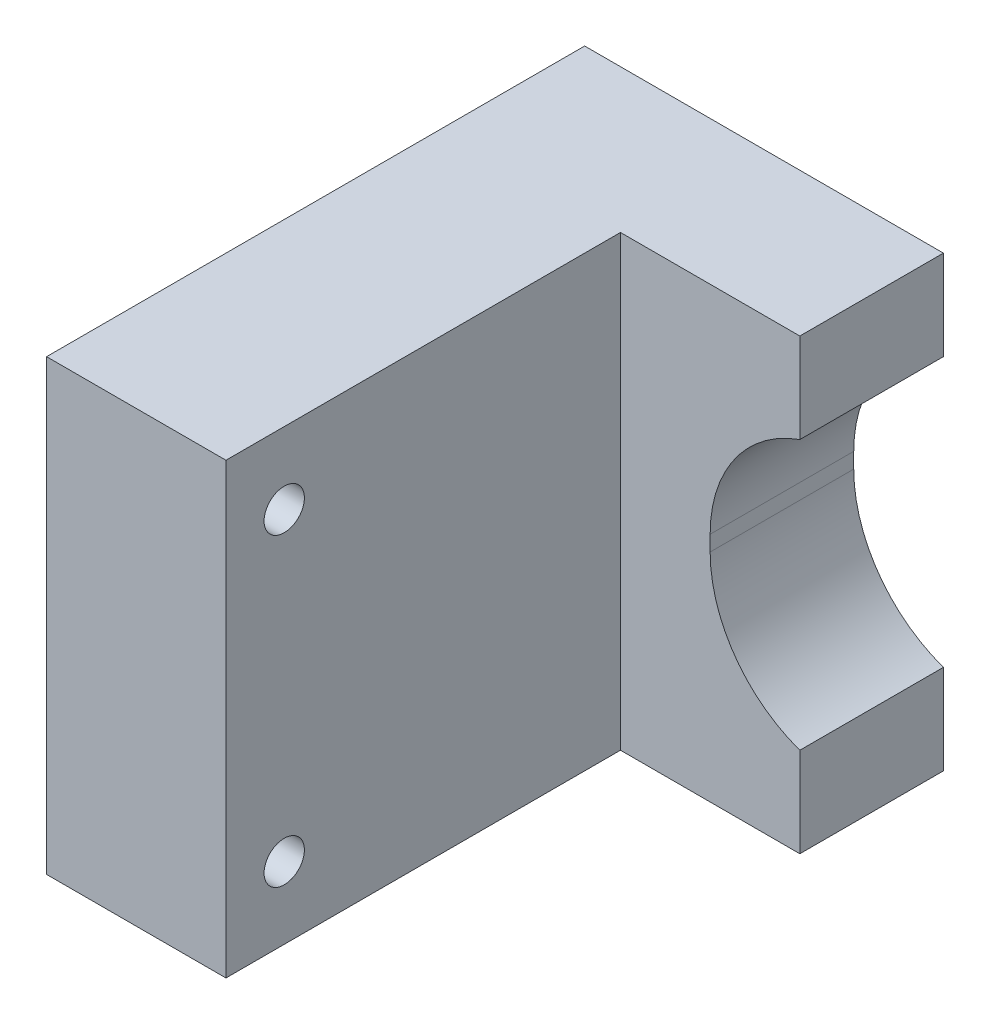
ISO-10303-21;
HEADER;
FILE_DESCRIPTION(('STEP AP214'),'2;1');
FILE_NAME('part.step','',(''),(''),'','','');
FILE_SCHEMA(('AUTOMOTIVE_DESIGN { 1 0 10303 214 1 1 1 1 }'));
ENDSEC;
DATA;
#1=APPLICATION_CONTEXT('core data for automotive mechanical design processes');
#2=APPLICATION_PROTOCOL_DEFINITION('international standard','automotive_design',2000,#1);
#3=PRODUCT_CONTEXT('',#1,'mechanical');
#4=PRODUCT('Part','Part','',(#3));
#5=PRODUCT_RELATED_PRODUCT_CATEGORY('part','',(#4));
#6=PRODUCT_DEFINITION_FORMATION('','',#4);
#7=PRODUCT_DEFINITION_CONTEXT('part definition',#1,'design');
#8=PRODUCT_DEFINITION('design','',#6,#7);
#9=PRODUCT_DEFINITION_SHAPE('','',#8);
#10=(LENGTH_UNIT() NAMED_UNIT(*) SI_UNIT(.MILLI.,.METRE.));
#11=(NAMED_UNIT(*) PLANE_ANGLE_UNIT() SI_UNIT($,.RADIAN.));
#12=(NAMED_UNIT(*) SI_UNIT($,.STERADIAN.) SOLID_ANGLE_UNIT());
#13=UNCERTAINTY_MEASURE_WITH_UNIT(LENGTH_MEASURE(1.E-05),#10,'distance_accuracy_value','');
#14=(GEOMETRIC_REPRESENTATION_CONTEXT(3) GLOBAL_UNCERTAINTY_ASSIGNED_CONTEXT((#13)) GLOBAL_UNIT_ASSIGNED_CONTEXT((#10,
#11,#12)) REPRESENTATION_CONTEXT('',''));
#15=CARTESIAN_POINT('',(0.,0.,0.));
#16=DIRECTION('',(0.,0.,1.));
#17=DIRECTION('',(1.,0.,0.));
#18=AXIS2_PLACEMENT_3D('',#15,#16,#17);
#19=CARTESIAN_POINT('',(30.,50.,0.));
#20=DIRECTION('',(1.,0.,0.));
#21=DIRECTION('',(0.,0.,-1.));
#22=AXIS2_PLACEMENT_3D('',#19,#20,#21);
#23=PLANE('',#22);
#24=DIRECTION('',(0.,0.,1.));
#25=VECTOR('',#24,1.);
#26=CARTESIAN_POINT('',(30.,40.,-13.9903927951499));
#27=LINE('',#26,#25);
#28=CARTESIAN_POINT('',(30.,40.,-30.));
#29=VERTEX_POINT('',#28);
#30=CARTESIAN_POINT('',(30.,40.,-13.9903927951499));
#31=VERTEX_POINT('',#30);
#32=EDGE_CURVE('E120',#29,#31,#27,.T.);
#33=ORIENTED_EDGE('',*,*,#32,.F.);
#34=DIRECTION('',(0.,-1.,0.));
#35=VECTOR('',#34,1.);
#36=CARTESIAN_POINT('',(30.,50.,-30.));
#37=LINE('',#36,#35);
#38=CARTESIAN_POINT('',(30.,50.,-30.));
#39=VERTEX_POINT('',#38);
#40=EDGE_CURVE('E133',#39,#29,#37,.T.);
#41=ORIENTED_EDGE('',*,*,#40,.F.);
#42=DIRECTION('',(0.,0.,1.));
#43=VECTOR('',#42,1.);
#44=CARTESIAN_POINT('',(30.,50.,0.));
#45=LINE('',#44,#43);
#46=CARTESIAN_POINT('',(30.,50.,-13.9903927951499));
#47=VERTEX_POINT('',#46);
#48=EDGE_CURVE('E172',#39,#47,#45,.T.);
#49=ORIENTED_EDGE('',*,*,#48,.T.);
#50=DIRECTION('',(0.,-1.,0.));
#51=VECTOR('',#50,1.);
#52=CARTESIAN_POINT('',(30.,50.,-13.9903927951499));
#53=LINE('',#52,#51);
#54=EDGE_CURVE('E132',#47,#31,#53,.T.);
#55=ORIENTED_EDGE('',*,*,#54,.T.);
#56=EDGE_LOOP('',(#33,#41,#49,#55));
#57=FACE_BOUND('',#56,.T.);
#58=ADVANCED_FACE('F35',(#57),#23,.T.);
#59=CARTESIAN_POINT('',(-10.,50.,0.));
#60=DIRECTION('',(-1.,0.,0.));
#61=DIRECTION('',(0.,0.,1.));
#62=AXIS2_PLACEMENT_3D('',#59,#60,#61);
#63=PLANE('',#62);
#64=CARTESIAN_POINT('',(-10.,8.,23.5));
#65=DIRECTION('',(-1.,0.,0.));
#66=DIRECTION('',(0.,0.,1.));
#67=AXIS2_PLACEMENT_3D('',#64,#65,#66);
#68=CIRCLE('',#67,4.2164);
#69=CARTESIAN_POINT('',(-10.,8.,27.7164));
#70=VERTEX_POINT('',#69);
#71=EDGE_CURVE('E203',#70,#70,#68,.T.);
#72=ORIENTED_EDGE('',*,*,#71,.F.);
#73=EDGE_LOOP('',(#72));
#74=FACE_BOUND('',#73,.T.);
#75=CARTESIAN_POINT('',(-10.,42.,23.5));
#76=DIRECTION('',(-1.,0.,0.));
#77=DIRECTION('',(0.,0.,1.));
#78=AXIS2_PLACEMENT_3D('',#75,#76,#77);
#79=CIRCLE('',#78,4.2164);
#80=CARTESIAN_POINT('',(-10.,42.,27.7164));
#81=VERTEX_POINT('',#80);
#82=EDGE_CURVE('E194',#81,#81,#79,.T.);
#83=ORIENTED_EDGE('',*,*,#82,.F.);
#84=EDGE_LOOP('',(#83));
#85=FACE_BOUND('',#84,.T.);
#86=DIRECTION('',(0.,0.,-1.));
#87=VECTOR('',#86,1.);
#88=CARTESIAN_POINT('',(-10.,0.,0.));
#89=LINE('',#88,#87);
#90=CARTESIAN_POINT('',(-10.,0.,30.));
#91=VERTEX_POINT('',#90);
#92=CARTESIAN_POINT('',(-10.,0.,-30.));
#93=VERTEX_POINT('',#92);
#94=EDGE_CURVE('E167',#91,#93,#89,.T.);
#95=ORIENTED_EDGE('',*,*,#94,.F.);
#96=DIRECTION('',(0.,-1.,0.));
#97=VECTOR('',#96,1.);
#98=CARTESIAN_POINT('',(-10.,50.,30.));
#99=LINE('',#98,#97);
#100=CARTESIAN_POINT('',(-10.,50.,30.));
#101=VERTEX_POINT('',#100);
#102=EDGE_CURVE('E144',#101,#91,#99,.T.);
#103=ORIENTED_EDGE('',*,*,#102,.F.);
#104=DIRECTION('',(0.,0.,-1.));
#105=VECTOR('',#104,1.);
#106=CARTESIAN_POINT('',(-10.,50.,0.));
#107=LINE('',#106,#105);
#108=CARTESIAN_POINT('',(-10.,50.,-30.));
#109=VERTEX_POINT('',#108);
#110=EDGE_CURVE('E158',#101,#109,#107,.T.);
#111=ORIENTED_EDGE('',*,*,#110,.T.);
#112=DIRECTION('',(0.,-1.,0.));
#113=VECTOR('',#112,1.);
#114=CARTESIAN_POINT('',(-10.,50.,-30.));
#115=LINE('',#114,#113);
#116=EDGE_CURVE('E152',#109,#93,#115,.T.);
#117=ORIENTED_EDGE('',*,*,#116,.T.);
#118=EDGE_LOOP('',(#95,#103,#111,#117));
#119=FACE_BOUND('',#118,.T.);
#120=ADVANCED_FACE('F257',(#74,#85,#119),#63,.T.);
#121=CARTESIAN_POINT('',(0.,50.,30.));
#122=DIRECTION('',(0.,0.,1.));
#123=DIRECTION('',(1.,0.,0.));
#124=AXIS2_PLACEMENT_3D('',#121,#122,#123);
#125=PLANE('',#124);
#126=DIRECTION('',(-1.,0.,0.));
#127=VECTOR('',#126,1.);
#128=CARTESIAN_POINT('',(0.,0.,30.));
#129=LINE('',#128,#127);
#130=CARTESIAN_POINT('',(10.,0.,30.));
#131=VERTEX_POINT('',#130);
#132=EDGE_CURVE('E164',#131,#91,#129,.T.);
#133=ORIENTED_EDGE('',*,*,#132,.F.);
#134=DIRECTION('',(0.,-1.,0.));
#135=VECTOR('',#134,1.);
#136=CARTESIAN_POINT('',(10.,50.,30.));
#137=LINE('',#136,#135);
#138=CARTESIAN_POINT('',(10.,50.,30.));
#139=VERTEX_POINT('',#138);
#140=EDGE_CURVE('E146',#139,#131,#137,.T.);
#141=ORIENTED_EDGE('',*,*,#140,.F.);
#142=DIRECTION('',(-1.,0.,0.));
#143=VECTOR('',#142,1.);
#144=CARTESIAN_POINT('',(0.,50.,30.));
#145=LINE('',#144,#143);
#146=EDGE_CURVE('E179',#139,#101,#145,.T.);
#147=ORIENTED_EDGE('',*,*,#146,.T.);
#148=ORIENTED_EDGE('',*,*,#102,.T.);
#149=EDGE_LOOP('',(#133,#141,#147,#148));
#150=FACE_BOUND('',#149,.T.);
#151=ADVANCED_FACE('F259',(#150),#125,.T.);
#152=CARTESIAN_POINT('',(10.,50.,0.));
#153=DIRECTION('',(-1.,0.,0.));
#154=DIRECTION('',(0.,0.,1.));
#155=AXIS2_PLACEMENT_3D('',#152,#153,#154);
#156=PLANE('',#155);
#157=CARTESIAN_POINT('',(10.,8.,23.5));
#158=DIRECTION('',(-1.,0.,0.));
#159=DIRECTION('',(0.,0.,1.));
#160=AXIS2_PLACEMENT_3D('',#157,#158,#159);
#161=CIRCLE('',#160,2.2479);
#162=CARTESIAN_POINT('',(10.,8.,25.7479));
#163=VERTEX_POINT('',#162);
#164=EDGE_CURVE('E197',#163,#163,#161,.T.);
#165=ORIENTED_EDGE('',*,*,#164,.T.);
#166=EDGE_LOOP('',(#165));
#167=FACE_BOUND('',#166,.T.);
#168=CARTESIAN_POINT('',(10.,42.,23.5));
#169=DIRECTION('',(-1.,0.,0.));
#170=DIRECTION('',(0.,0.,1.));
#171=AXIS2_PLACEMENT_3D('',#168,#169,#170);
#172=CIRCLE('',#171,2.2479);
#173=CARTESIAN_POINT('',(10.,42.,25.7479));
#174=VERTEX_POINT('',#173);
#175=EDGE_CURVE('E121',#174,#174,#172,.T.);
#176=ORIENTED_EDGE('',*,*,#175,.T.);
#177=EDGE_LOOP('',(#176));
#178=FACE_BOUND('',#177,.T.);
#179=DIRECTION('',(0.,0.,-1.));
#180=VECTOR('',#179,1.);
#181=CARTESIAN_POINT('',(10.,0.,0.));
#182=LINE('',#181,#180);
#183=CARTESIAN_POINT('',(10.,0.,-13.9903927951499));
#184=VERTEX_POINT('',#183);
#185=EDGE_CURVE('E162',#131,#184,#182,.T.);
#186=ORIENTED_EDGE('',*,*,#185,.T.);
#187=DIRECTION('',(0.,-1.,0.));
#188=VECTOR('',#187,1.);
#189=CARTESIAN_POINT('',(10.,50.,-13.9903927951499));
#190=LINE('',#189,#188);
#191=CARTESIAN_POINT('',(10.,50.,-13.9903927951499));
#192=VERTEX_POINT('',#191);
#193=EDGE_CURVE('E148',#192,#184,#190,.T.);
#194=ORIENTED_EDGE('',*,*,#193,.F.);
#195=DIRECTION('',(0.,0.,-1.));
#196=VECTOR('',#195,1.);
#197=CARTESIAN_POINT('',(10.,50.,0.));
#198=LINE('',#197,#196);
#199=EDGE_CURVE('E177',#139,#192,#198,.T.);
#200=ORIENTED_EDGE('',*,*,#199,.F.);
#201=ORIENTED_EDGE('',*,*,#140,.T.);
#202=EDGE_LOOP('',(#186,#194,#200,#201));
#203=FACE_BOUND('',#202,.T.);
#204=ADVANCED_FACE('F260',(#167,#178,#203),#156,.F.);
#205=CARTESIAN_POINT('',(0.,50.,-13.9903927951499));
#206=DIRECTION('',(0.,0.,-1.));
#207=DIRECTION('',(-1.,0.,0.));
#208=AXIS2_PLACEMENT_3D('',#205,#206,#207);
#209=PLANE('',#208);
#210=DIRECTION('',(0.,-1.,0.));
#211=VECTOR('',#210,1.);
#212=CARTESIAN_POINT('',(20.,40.,-13.9903927951499));
#213=LINE('',#212,#211);
#214=CARTESIAN_POINT('',(20.,25.8578643762691,-13.9903927951499));
#215=VERTEX_POINT('',#214);
#216=CARTESIAN_POINT('',(20.,24.142135623731,-13.9903927951499));
#217=VERTEX_POINT('',#216);
#218=EDGE_CURVE('E185',#215,#217,#213,.T.);
#219=ORIENTED_EDGE('',*,*,#218,.F.);
#220=CARTESIAN_POINT('',(35.,25.8578643762691,-13.9903927951499));
#221=DIRECTION('',(0.,0.,-1.));
#222=DIRECTION('',(-1.,0.,0.));
#223=AXIS2_PLACEMENT_3D('',#220,#221,#222);
#224=CIRCLE('',#223,15.);
#225=EDGE_CURVE('E43',#215,#31,#224,.T.);
#226=ORIENTED_EDGE('',*,*,#225,.T.);
#227=ORIENTED_EDGE('',*,*,#54,.F.);
#228=DIRECTION('',(1.,0.,0.));
#229=VECTOR('',#228,1.);
#230=CARTESIAN_POINT('',(0.,50.,-13.9903927951499));
#231=LINE('',#230,#229);
#232=EDGE_CURVE('E175',#192,#47,#231,.T.);
#233=ORIENTED_EDGE('',*,*,#232,.F.);
#234=ORIENTED_EDGE('',*,*,#193,.T.);
#235=DIRECTION('',(1.,0.,0.));
#236=VECTOR('',#235,1.);
#237=CARTESIAN_POINT('',(0.,0.,-13.9903927951499));
#238=LINE('',#237,#236);
#239=CARTESIAN_POINT('',(30.,0.,-13.9903927951499));
#240=VERTEX_POINT('',#239);
#241=EDGE_CURVE('E130',#184,#240,#238,.T.);
#242=ORIENTED_EDGE('',*,*,#241,.T.);
#243=CARTESIAN_POINT('',(30.,10.,-13.9903927951499));
#244=VERTEX_POINT('',#243);
#245=EDGE_CURVE('E116',#244,#240,#53,.T.);
#246=ORIENTED_EDGE('',*,*,#245,.F.);
#247=CARTESIAN_POINT('',(35.,24.142135623731,-13.9903927951499));
#248=DIRECTION('',(0.,0.,-1.));
#249=DIRECTION('',(-1.,0.,0.));
#250=AXIS2_PLACEMENT_3D('',#247,#248,#249);
#251=CIRCLE('',#250,15.);
#252=EDGE_CURVE('E126',#244,#217,#251,.T.);
#253=ORIENTED_EDGE('',*,*,#252,.T.);
#254=EDGE_LOOP('',(#219,#226,#227,#233,#234,#242,#246,#253));
#255=FACE_BOUND('',#254,.T.);
#256=ADVANCED_FACE('F125',(#255),#209,.F.);
#257=DIRECTION('',(0.,0.,-1.));
#258=VECTOR('',#257,1.);
#259=CARTESIAN_POINT('',(30.,10.,-13.9903927951499));
#260=LINE('',#259,#258);
#261=CARTESIAN_POINT('',(30.,10.,-30.));
#262=VERTEX_POINT('',#261);
#263=EDGE_CURVE('E112',#244,#262,#260,.T.);
#264=ORIENTED_EDGE('',*,*,#263,.F.);
#265=ORIENTED_EDGE('',*,*,#245,.T.);
#266=DIRECTION('',(0.,0.,1.));
#267=VECTOR('',#266,1.);
#268=CARTESIAN_POINT('',(30.,0.,0.));
#269=LINE('',#268,#267);
#270=CARTESIAN_POINT('',(30.,0.,-30.));
#271=VERTEX_POINT('',#270);
#272=EDGE_CURVE('E159',#271,#240,#269,.T.);
#273=ORIENTED_EDGE('',*,*,#272,.F.);
#274=EDGE_CURVE('E118',#262,#271,#37,.T.);
#275=ORIENTED_EDGE('',*,*,#274,.F.);
#276=EDGE_LOOP('',(#264,#265,#273,#275));
#277=FACE_BOUND('',#276,.T.);
#278=ADVANCED_FACE('F114',(#277),#23,.T.);
#279=CARTESIAN_POINT('',(0.,50.,-30.));
#280=DIRECTION('',(0.,0.,1.));
#281=DIRECTION('',(1.,0.,0.));
#282=AXIS2_PLACEMENT_3D('',#279,#280,#281);
#283=PLANE('',#282);
#284=CARTESIAN_POINT('',(0.,10.,-30.));
#285=DIRECTION('',(0.,0.,-1.));
#286=DIRECTION('',(-1.,0.,0.));
#287=AXIS2_PLACEMENT_3D('',#284,#285,#286);
#288=CIRCLE('',#287,2.5);
#289=CARTESIAN_POINT('',(-2.5,10.,-30.));
#290=VERTEX_POINT('',#289);
#291=EDGE_CURVE('E213',#290,#290,#288,.T.);
#292=ORIENTED_EDGE('',*,*,#291,.F.);
#293=EDGE_LOOP('',(#292));
#294=FACE_BOUND('',#293,.T.);
#295=CARTESIAN_POINT('',(0.,40.,-30.));
#296=DIRECTION('',(0.,0.,-1.));
#297=DIRECTION('',(-1.,0.,0.));
#298=AXIS2_PLACEMENT_3D('',#295,#296,#297);
#299=CIRCLE('',#298,2.5);
#300=CARTESIAN_POINT('',(-2.5,40.,-30.));
#301=VERTEX_POINT('',#300);
#302=EDGE_CURVE('E207',#301,#301,#299,.T.);
#303=ORIENTED_EDGE('',*,*,#302,.F.);
#304=EDGE_LOOP('',(#303));
#305=FACE_BOUND('',#304,.T.);
#306=ORIENTED_EDGE('',*,*,#40,.T.);
#307=CARTESIAN_POINT('',(35.,25.8578643762691,-30.));
#308=DIRECTION('',(0.,0.,1.));
#309=DIRECTION('',(1.,0.,0.));
#310=AXIS2_PLACEMENT_3D('',#307,#308,#309);
#311=CIRCLE('',#310,15.);
#312=CARTESIAN_POINT('',(20.,25.8578643762691,-30.));
#313=VERTEX_POINT('',#312);
#314=EDGE_CURVE('E11',#29,#313,#311,.T.);
#315=ORIENTED_EDGE('',*,*,#314,.T.);
#316=DIRECTION('',(0.,1.,0.));
#317=VECTOR('',#316,1.);
#318=CARTESIAN_POINT('',(20.,40.,-30.));
#319=LINE('',#318,#317);
#320=CARTESIAN_POINT('',(20.,24.142135623731,-30.));
#321=VERTEX_POINT('',#320);
#322=EDGE_CURVE('E170',#321,#313,#319,.T.);
#323=ORIENTED_EDGE('',*,*,#322,.F.);
#324=CARTESIAN_POINT('',(35.,24.142135623731,-30.));
#325=DIRECTION('',(0.,0.,1.));
#326=DIRECTION('',(1.,0.,0.));
#327=AXIS2_PLACEMENT_3D('',#324,#325,#326);
#328=CIRCLE('',#327,15.);
#329=EDGE_CURVE('E56',#321,#262,#328,.T.);
#330=ORIENTED_EDGE('',*,*,#329,.T.);
#331=ORIENTED_EDGE('',*,*,#274,.T.);
#332=DIRECTION('',(-1.,0.,0.));
#333=VECTOR('',#332,1.);
#334=CARTESIAN_POINT('',(0.,0.,-30.));
#335=LINE('',#334,#333);
#336=EDGE_CURVE('E155',#271,#93,#335,.T.);
#337=ORIENTED_EDGE('',*,*,#336,.T.);
#338=ORIENTED_EDGE('',*,*,#116,.F.);
#339=DIRECTION('',(-1.,0.,0.));
#340=VECTOR('',#339,1.);
#341=CARTESIAN_POINT('',(0.,50.,-30.));
#342=LINE('',#341,#340);
#343=EDGE_CURVE('E154',#39,#109,#342,.T.);
#344=ORIENTED_EDGE('',*,*,#343,.F.);
#345=EDGE_LOOP('',(#306,#315,#323,#330,#331,#337,#338,#344));
#346=FACE_BOUND('',#345,.T.);
#347=ADVANCED_FACE('F228',(#294,#305,#346),#283,.F.);
#348=CARTESIAN_POINT('',(0.,50.,0.));
#349=DIRECTION('',(0.,1.,0.));
#350=DIRECTION('',(0.,0.,1.));
#351=AXIS2_PLACEMENT_3D('',#348,#349,#350);
#352=PLANE('',#351);
#353=ORIENTED_EDGE('',*,*,#110,.F.);
#354=ORIENTED_EDGE('',*,*,#146,.F.);
#355=ORIENTED_EDGE('',*,*,#199,.T.);
#356=ORIENTED_EDGE('',*,*,#232,.T.);
#357=ORIENTED_EDGE('',*,*,#48,.F.);
#358=ORIENTED_EDGE('',*,*,#343,.T.);
#359=EDGE_LOOP('',(#353,#354,#355,#356,#357,#358));
#360=FACE_BOUND('',#359,.T.);
#361=ADVANCED_FACE('F231',(#360),#352,.T.);
#362=CARTESIAN_POINT('',(0.,0.,0.));
#363=DIRECTION('',(0.,1.,0.));
#364=DIRECTION('',(0.,0.,1.));
#365=AXIS2_PLACEMENT_3D('',#362,#363,#364);
#366=PLANE('',#365);
#367=ORIENTED_EDGE('',*,*,#94,.T.);
#368=ORIENTED_EDGE('',*,*,#336,.F.);
#369=ORIENTED_EDGE('',*,*,#272,.T.);
#370=ORIENTED_EDGE('',*,*,#241,.F.);
#371=ORIENTED_EDGE('',*,*,#185,.F.);
#372=ORIENTED_EDGE('',*,*,#132,.T.);
#373=EDGE_LOOP('',(#367,#368,#369,#370,#371,#372));
#374=FACE_BOUND('',#373,.T.);
#375=ADVANCED_FACE('F252',(#374),#366,.F.);
#376=CARTESIAN_POINT('',(20.,0.,0.));
#377=DIRECTION('',(1.,0.,0.));
#378=DIRECTION('',(0.,0.,-1.));
#379=AXIS2_PLACEMENT_3D('',#376,#377,#378);
#380=PLANE('',#379);
#381=ORIENTED_EDGE('',*,*,#218,.T.);
#382=DIRECTION('',(0.,0.,-1.));
#383=VECTOR('',#382,1.);
#384=CARTESIAN_POINT('',(20.,24.142135623731,-30.));
#385=LINE('',#384,#383);
#386=EDGE_CURVE('E136',#217,#321,#385,.T.);
#387=ORIENTED_EDGE('',*,*,#386,.T.);
#388=ORIENTED_EDGE('',*,*,#322,.T.);
#389=DIRECTION('',(0.,0.,1.));
#390=VECTOR('',#389,1.);
#391=CARTESIAN_POINT('',(20.,25.8578643762691,-13.9903927951499));
#392=LINE('',#391,#390);
#393=EDGE_CURVE('E141',#313,#215,#392,.T.);
#394=ORIENTED_EDGE('',*,*,#393,.T.);
#395=EDGE_LOOP('',(#381,#387,#388,#394));
#396=FACE_BOUND('',#395,.T.);
#397=ADVANCED_FACE('F241',(#396),#380,.T.);
#398=CARTESIAN_POINT('',(35.,24.142135623731,-13.9903927951499));
#399=DIRECTION('',(0.,0.,1.));
#400=DIRECTION('',(1.,0.,0.));
#401=AXIS2_PLACEMENT_3D('',#398,#399,#400);
#402=CYLINDRICAL_SURFACE('',#401,15.);
#403=ORIENTED_EDGE('',*,*,#252,.F.);
#404=ORIENTED_EDGE('',*,*,#263,.T.);
#405=ORIENTED_EDGE('',*,*,#329,.F.);
#406=ORIENTED_EDGE('',*,*,#386,.F.);
#407=EDGE_LOOP('',(#403,#404,#405,#406));
#408=FACE_BOUND('',#407,.T.);
#409=ADVANCED_FACE('F135',(#408),#402,.F.);
#410=CARTESIAN_POINT('',(35.,25.8578643762691,-13.9903927951499));
#411=DIRECTION('',(0.,0.,-1.));
#412=DIRECTION('',(-1.,0.,0.));
#413=AXIS2_PLACEMENT_3D('',#410,#411,#412);
#414=CYLINDRICAL_SURFACE('',#413,15.);
#415=ORIENTED_EDGE('',*,*,#314,.F.);
#416=ORIENTED_EDGE('',*,*,#32,.T.);
#417=ORIENTED_EDGE('',*,*,#225,.F.);
#418=ORIENTED_EDGE('',*,*,#393,.F.);
#419=EDGE_LOOP('',(#415,#416,#417,#418));
#420=FACE_BOUND('',#419,.T.);
#421=ADVANCED_FACE('F37',(#420),#414,.F.);
#422=CARTESIAN_POINT('',(-10.,42.,23.5));
#423=DIRECTION('',(-1.,0.,0.));
#424=DIRECTION('',(0.,0.,1.));
#425=AXIS2_PLACEMENT_3D('',#422,#423,#424);
#426=CYLINDRICAL_SURFACE('',#425,2.2479);
#427=ORIENTED_EDGE('',*,*,#175,.F.);
#428=EDGE_LOOP('',(#427));
#429=FACE_BOUND('',#428,.T.);
#430=CARTESIAN_POINT('',(-8.34823237602752,42.,23.5));
#431=DIRECTION('',(-1.,0.,0.));
#432=DIRECTION('',(0.,0.,1.));
#433=AXIS2_PLACEMENT_3D('',#430,#431,#432);
#434=CIRCLE('',#433,2.2479);
#435=CARTESIAN_POINT('',(-8.34823237602752,42.,25.7479));
#436=VERTEX_POINT('',#435);
#437=EDGE_CURVE('E191',#436,#436,#434,.T.);
#438=ORIENTED_EDGE('',*,*,#437,.T.);
#439=EDGE_LOOP('',(#438));
#440=FACE_BOUND('',#439,.T.);
#441=ADVANCED_FACE('F325',(#429,#440),#426,.F.);
#442=CARTESIAN_POINT('',(-10.,42.,23.5));
#443=DIRECTION('',(-1.,0.,0.));
#444=DIRECTION('',(0.,0.,1.));
#445=AXIS2_PLACEMENT_3D('',#442,#443,#444);
#446=CONICAL_SURFACE('',#445,4.2164,0.872664625997166);
#447=ORIENTED_EDGE('',*,*,#437,.F.);
#448=EDGE_LOOP('',(#447));
#449=FACE_BOUND('',#448,.T.);
#450=ORIENTED_EDGE('',*,*,#82,.T.);
#451=EDGE_LOOP('',(#450));
#452=FACE_BOUND('',#451,.T.);
#453=ADVANCED_FACE('F330',(#449,#452),#446,.F.);
#454=CARTESIAN_POINT('',(-10.,8.,23.5));
#455=DIRECTION('',(-1.,0.,0.));
#456=DIRECTION('',(0.,0.,1.));
#457=AXIS2_PLACEMENT_3D('',#454,#455,#456);
#458=CYLINDRICAL_SURFACE('',#457,2.2479);
#459=ORIENTED_EDGE('',*,*,#164,.F.);
#460=EDGE_LOOP('',(#459));
#461=FACE_BOUND('',#460,.T.);
#462=CARTESIAN_POINT('',(-8.34823237602752,8.,23.5));
#463=DIRECTION('',(-1.,0.,0.));
#464=DIRECTION('',(0.,0.,1.));
#465=AXIS2_PLACEMENT_3D('',#462,#463,#464);
#466=CIRCLE('',#465,2.2479);
#467=CARTESIAN_POINT('',(-8.34823237602752,8.,25.7479));
#468=VERTEX_POINT('',#467);
#469=EDGE_CURVE('E200',#468,#468,#466,.T.);
#470=ORIENTED_EDGE('',*,*,#469,.T.);
#471=EDGE_LOOP('',(#470));
#472=FACE_BOUND('',#471,.T.);
#473=ADVANCED_FACE('F338',(#461,#472),#458,.F.);
#474=CARTESIAN_POINT('',(-10.,8.,23.5));
#475=DIRECTION('',(-1.,0.,0.));
#476=DIRECTION('',(0.,0.,1.));
#477=AXIS2_PLACEMENT_3D('',#474,#475,#476);
#478=CONICAL_SURFACE('',#477,4.2164,0.872664625997165);
#479=ORIENTED_EDGE('',*,*,#469,.F.);
#480=EDGE_LOOP('',(#479));
#481=FACE_BOUND('',#480,.T.);
#482=ORIENTED_EDGE('',*,*,#71,.T.);
#483=EDGE_LOOP('',(#482));
#484=FACE_BOUND('',#483,.T.);
#485=ADVANCED_FACE('F346',(#481,#484),#478,.F.);
#486=CARTESIAN_POINT('',(0.,40.,0.));
#487=DIRECTION('',(0.,0.,-1.));
#488=DIRECTION('',(-1.,0.,0.));
#489=AXIS2_PLACEMENT_3D('',#486,#487,#488);
#490=CYLINDRICAL_SURFACE('',#489,2.5);
#491=CARTESIAN_POINT('',(0.,40.,0.));
#492=DIRECTION('',(0.,0.,-1.));
#493=DIRECTION('',(-1.,0.,0.));
#494=AXIS2_PLACEMENT_3D('',#491,#492,#493);
#495=CIRCLE('',#494,2.5);
#496=CARTESIAN_POINT('',(-2.5,40.,0.));
#497=VERTEX_POINT('',#496);
#498=EDGE_CURVE('E210',#497,#497,#495,.T.);
#499=ORIENTED_EDGE('',*,*,#498,.F.);
#500=EDGE_LOOP('',(#499));
#501=FACE_BOUND('',#500,.T.);
#502=ORIENTED_EDGE('',*,*,#302,.T.);
#503=EDGE_LOOP('',(#502));
#504=FACE_BOUND('',#503,.T.);
#505=ADVANCED_FACE('F353',(#501,#504),#490,.F.);
#506=CARTESIAN_POINT('',(0.,40.,0.));
#507=DIRECTION('',(0.,0.,-1.));
#508=DIRECTION('',(-1.,0.,0.));
#509=AXIS2_PLACEMENT_3D('',#506,#507,#508);
#510=PLANE('',#509);
#511=ORIENTED_EDGE('',*,*,#498,.T.);
#512=EDGE_LOOP('',(#511));
#513=FACE_BOUND('',#512,.T.);
#514=ADVANCED_FACE('F224',(#513),#510,.T.);
#515=CARTESIAN_POINT('',(0.,10.,0.));
#516=DIRECTION('',(0.,0.,-1.));
#517=DIRECTION('',(-1.,0.,0.));
#518=AXIS2_PLACEMENT_3D('',#515,#516,#517);
#519=CYLINDRICAL_SURFACE('',#518,2.5);
#520=CARTESIAN_POINT('',(0.,10.,0.));
#521=DIRECTION('',(0.,0.,-1.));
#522=DIRECTION('',(-1.,0.,0.));
#523=AXIS2_PLACEMENT_3D('',#520,#521,#522);
#524=CIRCLE('',#523,2.5);
#525=CARTESIAN_POINT('',(-2.5,10.,0.));
#526=VERTEX_POINT('',#525);
#527=EDGE_CURVE('E206',#526,#526,#524,.T.);
#528=ORIENTED_EDGE('',*,*,#527,.F.);
#529=EDGE_LOOP('',(#528));
#530=FACE_BOUND('',#529,.T.);
#531=ORIENTED_EDGE('',*,*,#291,.T.);
#532=EDGE_LOOP('',(#531));
#533=FACE_BOUND('',#532,.T.);
#534=ADVANCED_FACE('F221',(#530,#533),#519,.F.);
#535=CARTESIAN_POINT('',(0.,10.,0.));
#536=DIRECTION('',(0.,0.,-1.));
#537=DIRECTION('',(-1.,0.,0.));
#538=AXIS2_PLACEMENT_3D('',#535,#536,#537);
#539=PLANE('',#538);
#540=ORIENTED_EDGE('',*,*,#527,.T.);
#541=EDGE_LOOP('',(#540));
#542=FACE_BOUND('',#541,.T.);
#543=ADVANCED_FACE('F219',(#542),#539,.T.);
#544=CLOSED_SHELL('',(#58,#120,#151,#204,#256,#278,#347,#361,#375,#397,#409,#421,#441,#453,#473,
#485,#505,#514,#534,#543));
#545=MANIFOLD_SOLID_BREP('B2',#544);
#546=ADVANCED_BREP_SHAPE_REPRESENTATION('',(#18,#545),#14);
#547=SHAPE_DEFINITION_REPRESENTATION(#9,#546);
ENDSEC;
END-ISO-10303-21;
